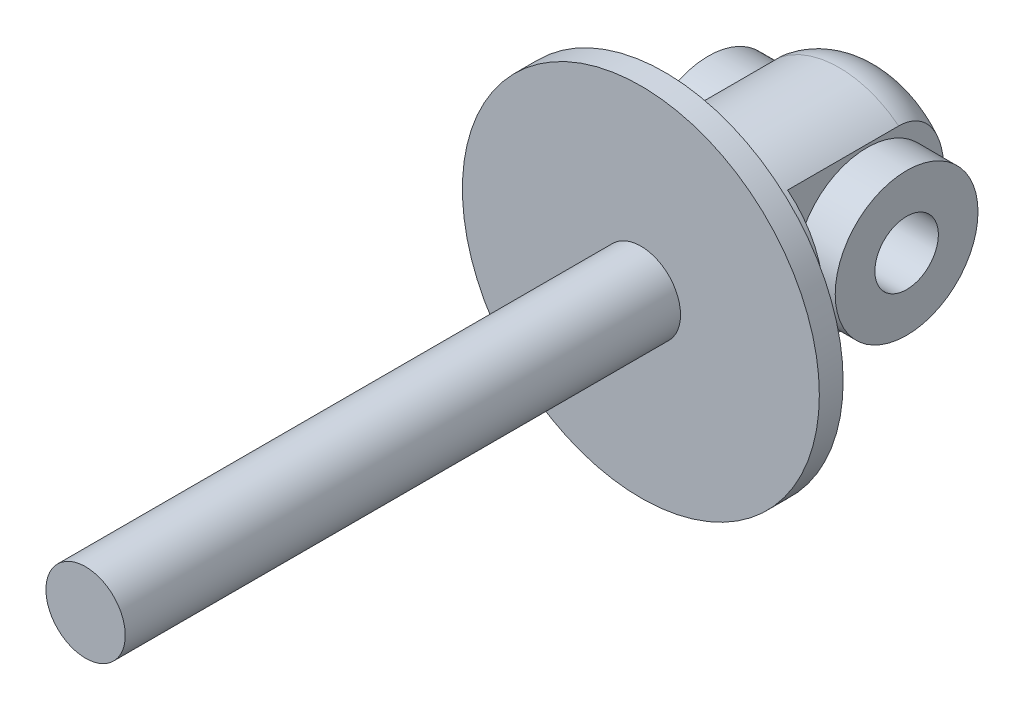
ISO-10303-21;
HEADER;
FILE_DESCRIPTION(('STEP AP214'),'2;1');
FILE_NAME('part.step','',(''),(''),'','','');
FILE_SCHEMA(('AUTOMOTIVE_DESIGN { 1 0 10303 214 1 1 1 1 }'));
ENDSEC;
DATA;
#1=APPLICATION_CONTEXT('core data for automotive mechanical design processes');
#2=APPLICATION_PROTOCOL_DEFINITION('international standard','automotive_design',2000,#1);
#3=PRODUCT_CONTEXT('',#1,'mechanical');
#4=PRODUCT('Part','Part','',(#3));
#5=PRODUCT_RELATED_PRODUCT_CATEGORY('part','',(#4));
#6=PRODUCT_DEFINITION_FORMATION('','',#4);
#7=PRODUCT_DEFINITION_CONTEXT('part definition',#1,'design');
#8=PRODUCT_DEFINITION('design','',#6,#7);
#9=PRODUCT_DEFINITION_SHAPE('','',#8);
#10=(LENGTH_UNIT() NAMED_UNIT(*) SI_UNIT(.MILLI.,.METRE.));
#11=(NAMED_UNIT(*) PLANE_ANGLE_UNIT() SI_UNIT($,.RADIAN.));
#12=(NAMED_UNIT(*) SI_UNIT($,.STERADIAN.) SOLID_ANGLE_UNIT());
#13=UNCERTAINTY_MEASURE_WITH_UNIT(LENGTH_MEASURE(1.E-05),#10,'distance_accuracy_value','');
#14=(GEOMETRIC_REPRESENTATION_CONTEXT(3) GLOBAL_UNCERTAINTY_ASSIGNED_CONTEXT((#13)) GLOBAL_UNIT_ASSIGNED_CONTEXT((#10,
#11,#12)) REPRESENTATION_CONTEXT('',''));
#15=CARTESIAN_POINT('',(0.,0.,0.));
#16=DIRECTION('',(0.,0.,1.));
#17=DIRECTION('',(1.,0.,0.));
#18=AXIS2_PLACEMENT_3D('',#15,#16,#17);
#19=CARTESIAN_POINT('',(-7.49999999999999,-22.5,-8.));
#20=DIRECTION('',(1.,0.,0.));
#21=DIRECTION('',(0.,0.,-1.));
#22=AXIS2_PLACEMENT_3D('',#19,#20,#21);
#23=PLANE('',#22);
#24=CARTESIAN_POINT('',(-7.5,0.,-27.8094750193111));
#25=CARTESIAN_POINT('',(-7.5,-0.18452162824242,-27.8094752958151));
#26=CARTESIAN_POINT('',(-7.5,-0.369043480287192,-27.8077270322999));
#27=CARTESIAN_POINT('',(-7.5,-0.737999394292286,-27.8006130628877));
#28=CARTESIAN_POINT('',(-7.5,-0.922433463434386,-27.7952477367066));
#29=CARTESIAN_POINT('',(-7.5,-1.29122559425462,-27.780538513706));
#30=CARTESIAN_POINT('',(-7.5,-1.47558358999919,-27.7711929215574));
#31=CARTESIAN_POINT('',(-7.5,-1.84401846668315,-27.7479507640883));
#32=CARTESIAN_POINT('',(-7.5,-2.0280953439834,-27.734054140347));
#33=CARTESIAN_POINT('',(-7.5,-2.39498843631837,-27.701027325669));
#34=CARTESIAN_POINT('',(-7.5,-2.57780665418327,-27.6819201299087));
#35=CARTESIAN_POINT('',(-7.5,-2.94269408038084,-27.6375682217561));
#36=CARTESIAN_POINT('',(-7.5,-3.12476323156505,-27.6123230495969));
#37=CARTESIAN_POINT('',(-7.5,-3.6691632505479,-27.5259360262262));
#38=CARTESIAN_POINT('',(-7.5,-4.029977395301,-27.4541196223952));
#39=CARTESIAN_POINT('',(-7.5,-4.57935988961709,-27.315114172541));
#40=CARTESIAN_POINT('',(-7.5,-4.7712225645297,-27.2608348848703));
#41=CARTESIAN_POINT('',(-7.5,-5.15109529504943,-27.1402411036094));
#42=CARTESIAN_POINT('',(-7.5,-5.3391068078654,-27.0739312594077));
#43=CARTESIAN_POINT('',(-7.5,-5.70992505463464,-26.9281486989919));
#44=CARTESIAN_POINT('',(-7.5,-5.8927332791208,-26.8486797977089));
#45=CARTESIAN_POINT('',(-7.5,-6.25155879665884,-26.6756224712841));
#46=CARTESIAN_POINT('',(-7.5,-6.4275772388346,-26.5820364486501));
#47=CARTESIAN_POINT('',(-7.5,-6.74413785402998,-26.3958384208508));
#48=CARTESIAN_POINT('',(-7.5,-6.8859302136676,-26.3053527427416));
#49=CARTESIAN_POINT('',(-7.5,-7.16205254122039,-26.1136422044668));
#50=CARTESIAN_POINT('',(-7.5,-7.29638393401337,-26.0124194056704));
#51=CARTESIAN_POINT('',(-7.5,-7.55627452274062,-25.7991822855038));
#52=CARTESIAN_POINT('',(-7.5,-7.6818315054992,-25.6871652583255));
#53=CARTESIAN_POINT('',(-7.5,-7.92270374400352,-25.4525813942248));
#54=CARTESIAN_POINT('',(-7.5,-8.03801892249803,-25.3300144777409));
#55=CARTESIAN_POINT('',(-7.5,-8.25792234562976,-25.0736714823962));
#56=CARTESIAN_POINT('',(-7.5,-8.36240569865935,-24.9398051473305));
#57=CARTESIAN_POINT('',(-7.5,-8.55796576900282,-24.662616920615));
#58=CARTESIAN_POINT('',(-7.5,-8.64904436046083,-24.5192963548439));
#59=CARTESIAN_POINT('',(-7.5,-8.81636481076627,-24.2243409104845));
#60=CARTESIAN_POINT('',(-7.5,-8.89261579636784,-24.0727112205184));
#61=CARTESIAN_POINT('',(-7.5,-9.02909243430966,-23.7624095052739));
#62=CARTESIAN_POINT('',(-7.5,-9.08932115899454,-23.6037388369551));
#63=CARTESIAN_POINT('',(-7.5,-9.1849514334904,-23.3052245459151));
#64=CARTESIAN_POINT('',(-7.5,-9.22272405795734,-23.166136129491));
#65=CARTESIAN_POINT('',(-7.5,-9.28547940350164,-22.8851087613884));
#66=CARTESIAN_POINT('',(-7.5,-9.31046370365637,-22.7431701638949));
#67=CARTESIAN_POINT('',(-7.5,-9.34730641699016,-22.4576599589478));
#68=CARTESIAN_POINT('',(-7.5,-9.35917031033292,-22.3140890586128));
#69=CARTESIAN_POINT('',(-7.5,-9.36963164548865,-22.0264648581988));
#70=CARTESIAN_POINT('',(-7.5,-9.36822954903947,-21.8824115750842));
#71=CARTESIAN_POINT('',(-7.5,-9.35280339576898,-21.6061914815275));
#72=CARTESIAN_POINT('',(-7.5,-9.33976569953801,-21.4739684759153));
#73=CARTESIAN_POINT('',(-7.5,-9.3025636387872,-21.2110534946456));
#74=CARTESIAN_POINT('',(-7.5,-9.27839574533066,-21.0803620180608));
#75=CARTESIAN_POINT('',(-7.5,-9.21922065645586,-20.8215410609612));
#76=CARTESIAN_POINT('',(-7.5,-9.1842198149556,-20.6934101253726));
#77=CARTESIAN_POINT('',(-7.5,-9.1037455253616,-20.4404340442512));
#78=CARTESIAN_POINT('',(-7.5,-9.05826815366643,-20.3155901493276));
#79=CARTESIAN_POINT('',(-7.5,-8.95699564520569,-20.0692031015505));
#80=CARTESIAN_POINT('',(-7.5,-8.90113499399755,-19.9476868658852));
#81=CARTESIAN_POINT('',(-7.5,-8.77987692751896,-19.7094920695402));
#82=CARTESIAN_POINT('',(-7.5,-8.71447610526943,-19.5928152563103));
#83=CARTESIAN_POINT('',(-7.5,-8.50489875856371,-19.2509911073174));
#84=CARTESIAN_POINT('',(-7.5,-8.34729299116934,-19.0339195251877));
#85=CARTESIAN_POINT('',(-7.5,-7.98870608163152,-18.609337427954));
#86=CARTESIAN_POINT('',(-7.5,-7.785297559506,-18.4039002281567));
#87=CARTESIAN_POINT('',(-7.5,-7.35109040646742,-18.0246758733926));
#88=CARTESIAN_POINT('',(-7.5,-7.12029612399673,-17.8508837047537));
#89=CARTESIAN_POINT('',(-7.5,-6.69864287979114,-17.5744409595824));
#90=CARTESIAN_POINT('',(-7.5,-6.51223410047272,-17.4648689537028));
#91=CARTESIAN_POINT('',(-7.5,-6.13034538679085,-17.2626904112622));
#92=CARTESIAN_POINT('',(-7.5,-5.93486117014358,-17.1700919878543));
#93=CARTESIAN_POINT('',(-7.5,-5.53658641063457,-17.0006313082269));
#94=CARTESIAN_POINT('',(-7.5,-5.33377659321379,-16.9238147555949));
#95=CARTESIAN_POINT('',(-7.5,-4.92331428460809,-16.784875362625));
#96=CARTESIAN_POINT('',(-7.5,-4.71566315546473,-16.7227484430634));
#97=CARTESIAN_POINT('',(-7.5,-4.02250667384634,-16.5386673542946));
#98=CARTESIAN_POINT('',(-7.5,-3.5294265636988,-16.4449803111871));
#99=CARTESIAN_POINT('',(-7.5,-2.78498720051464,-16.3412352530644));
#100=CARTESIAN_POINT('',(-7.5,-2.53568557770047,-16.3127705467372));
#101=CARTESIAN_POINT('',(-7.5,-2.03612434937436,-16.2658269581612));
#102=CARTESIAN_POINT('',(-7.5,-1.78586486368139,-16.2473468655648));
#103=CARTESIAN_POINT('',(-7.5,-1.2836311240865,-16.2184283009414));
#104=CARTESIAN_POINT('',(-7.5,-1.03165466176089,-16.208031590786));
#105=CARTESIAN_POINT('',(-7.5,-0.527501194688652,-16.1941849220443));
#106=CARTESIAN_POINT('',(-7.5,-0.275324180848882,-16.1907352988047));
#107=CARTESIAN_POINT('',(-7.5,0.228731345603008,-16.1903333462322));
#108=CARTESIAN_POINT('',(-7.5,0.480609853630207,-16.193373232494));
#109=CARTESIAN_POINT('',(-7.5,0.984173581494302,-16.2063332691715));
#110=CARTESIAN_POINT('',(-7.5,1.23585881660878,-16.2162528039696));
#111=CARTESIAN_POINT('',(-7.5,1.76278825668937,-16.2454935008677));
#112=CARTESIAN_POINT('',(-7.5,2.03798990109175,-16.2656211327378));
#113=CARTESIAN_POINT('',(-7.5,2.58731345976841,-16.3180418431018));
#114=CARTESIAN_POINT('',(-7.5,2.86143522597446,-16.3503365349836));
#115=CARTESIAN_POINT('',(-7.5,3.40623279358439,-16.4300545548583));
#116=CARTESIAN_POINT('',(-7.5,3.67691867401875,-16.4774071358833));
#117=CARTESIAN_POINT('',(-7.5,4.21439476079953,-16.5907053400646));
#118=CARTESIAN_POINT('',(-7.5,4.48118620316471,-16.6566449229111));
#119=CARTESIAN_POINT('',(-7.5,4.94217748017443,-16.7911834026755));
#120=CARTESIAN_POINT('',(-7.5,5.13778160857808,-16.8549558474619));
#121=CARTESIAN_POINT('',(-7.5,5.5239942274174,-16.9961265709521));
#122=CARTESIAN_POINT('',(-7.5,5.71460418712137,-17.073520789267));
#123=CARTESIAN_POINT('',(-7.5,6.0892198722189,-17.2430793617625));
#124=CARTESIAN_POINT('',(-7.5,6.27322442084439,-17.3352463319138));
#125=CARTESIAN_POINT('',(-7.5,6.63256976145458,-17.5351759469553));
#126=CARTESIAN_POINT('',(-7.5,6.80791280693599,-17.6429345063483));
#127=CARTESIAN_POINT('',(-7.5,7.10989658300675,-17.8487615005737));
#128=CARTESIAN_POINT('',(-7.5,7.2387010399764,-17.9436617626469));
#129=CARTESIAN_POINT('',(-7.5,7.48856622066219,-18.143229826346));
#130=CARTESIAN_POINT('',(-7.5,7.60962602152205,-18.2478987883735));
#131=CARTESIAN_POINT('',(-7.5,7.84271387792475,-18.4668045949393));
#132=CARTESIAN_POINT('',(-7.5,7.95474473789613,-18.5810384459287));
#133=CARTESIAN_POINT('',(-7.5,8.16854933672495,-18.8187268203134));
#134=CARTESIAN_POINT('',(-7.5,8.27032449994957,-18.9421800591116));
#135=CARTESIAN_POINT('',(-7.5,8.46313596223061,-19.1987356397018));
#136=CARTESIAN_POINT('',(-7.5,8.55408255407203,-19.3319055781875));
#137=CARTESIAN_POINT('',(-7.5,8.72304401015934,-19.6061418402457));
#138=CARTESIAN_POINT('',(-7.5,8.80106500403696,-19.747204378254));
#139=CARTESIAN_POINT('',(-7.5,8.94309470867639,-20.0362068877473));
#140=CARTESIAN_POINT('',(-7.5,9.00710515749598,-20.1841460034049));
#141=CARTESIAN_POINT('',(-7.5,9.12014361193693,-20.4856380297523));
#142=CARTESIAN_POINT('',(-7.5,9.16917373274798,-20.6391901444676));
#143=CARTESIAN_POINT('',(-7.5,9.24643392787081,-20.9313639562727));
#144=CARTESIAN_POINT('',(-7.5,9.2764768563288,-21.0695088202567));
#145=CARTESIAN_POINT('',(-7.5,9.32406143536891,-21.3479315795213));
#146=CARTESIAN_POINT('',(-7.5,9.34160421520928,-21.4882092809526));
#147=CARTESIAN_POINT('',(-7.5,9.36396002322678,-21.769719609589));
#148=CARTESIAN_POINT('',(-7.5,9.36877802253041,-21.9109518422674));
#149=CARTESIAN_POINT('',(-7.5,9.36563613906261,-22.1932734390957));
#150=CARTESIAN_POINT('',(-7.5,9.35767657732182,-22.3343628067459));
#151=CARTESIAN_POINT('',(-7.5,9.32998563551062,-22.6064011749062));
#152=CARTESIAN_POINT('',(-7.5,9.31102660205279,-22.7374295539783));
#153=CARTESIAN_POINT('',(-7.5,9.26218788836622,-22.9974780227225));
#154=CARTESIAN_POINT('',(-7.5,9.23230470755187,-23.1264974548056));
#155=CARTESIAN_POINT('',(-7.5,9.16196479385525,-23.3815508516768));
#156=CARTESIAN_POINT('',(-7.5,9.12151307666088,-23.5075862018083));
#157=CARTESIAN_POINT('',(-7.5,9.03044888037393,-23.7559772755244));
#158=CARTESIAN_POINT('',(-7.5,8.97983258590813,-23.8783315975104));
#159=CARTESIAN_POINT('',(-7.5,8.8680617574251,-24.1205569584555));
#160=CARTESIAN_POINT('',(-7.5,8.8067487702029,-24.2403549182387));
#161=CARTESIAN_POINT('',(-7.5,8.67480187441993,-24.4747211723639));
#162=CARTESIAN_POINT('',(-7.5,8.60416462323316,-24.5892875713423));
#163=CARTESIAN_POINT('',(-7.5,8.37928997825773,-24.9242270275788));
#164=CARTESIAN_POINT('',(-7.5,8.21201407264852,-25.13600210755));
#165=CARTESIAN_POINT('',(-7.5,7.832942739178,-25.5504485361803));
#166=CARTESIAN_POINT('',(-7.5,7.61853228584699,-25.7507010772538));
#167=CARTESIAN_POINT('',(-7.5,7.16337882817298,-26.1185076671662));
#168=CARTESIAN_POINT('',(-7.5,6.92262753032979,-26.2860513710234));
#169=CARTESIAN_POINT('',(-7.5,6.4788664395953,-26.5545024709803));
#170=CARTESIAN_POINT('',(-7.5,6.279707295078,-26.6619013252763));
#171=CARTESIAN_POINT('',(-7.5,5.87254463104013,-26.858559219587));
#172=CARTESIAN_POINT('',(-7.5,5.66453691936401,-26.9478095430477));
#173=CARTESIAN_POINT('',(-7.5,5.24180758530232,-27.1096214973705));
#174=CARTESIAN_POINT('',(-7.5,5.02707553901331,-27.1821555960046));
#175=CARTESIAN_POINT('',(-7.5,4.59305326757356,-27.3121001369762));
#176=CARTESIAN_POINT('',(-7.5,4.37376133898656,-27.3695048137837));
#177=CARTESIAN_POINT('',(-7.5,3.81417726059936,-27.4981886749365));
#178=CARTESIAN_POINT('',(-7.5,3.47183296905169,-27.5604951716191));
#179=CARTESIAN_POINT('',(-7.5,2.78359200614869,-27.6609019684328));
#180=CARTESIAN_POINT('',(-7.5,2.43769315620305,-27.6989863972919));
#181=CARTESIAN_POINT('',(-7.5,1.91723181279188,-27.7425563308733));
#182=CARTESIAN_POINT('',(-7.5,1.74318957751326,-27.7548291128016));
#183=CARTESIAN_POINT('',(-7.5,1.39487161182967,-27.7753986995787));
#184=CARTESIAN_POINT('',(-7.5,1.22059588725638,-27.7836956019396));
#185=CARTESIAN_POINT('',(-7.5,0.871965392986038,-27.796777523185));
#186=CARTESIAN_POINT('',(-7.5,0.697610658492168,-27.8015635129394));
#187=CARTESIAN_POINT('',(-7.5,0.34883735064389,-27.8079121855994));
#188=CARTESIAN_POINT('',(-7.5,0.174418775305037,-27.8094747579462));
#189=CARTESIAN_POINT('',(-7.5,0.,-27.8094750193111));
#190=B_SPLINE_CURVE_WITH_KNOTS('',3,(#24,#25,#26,#27,#28,#29,#30,#31,#32,#33,#34,#35,#36,#37,
#38,#39,#40,#41,#42,#43,#44,#45,#46,#47,#48,#49,#50,#51,#52,#53,#54,#55,#56,#57,#58,#59,#60,#61,
#62,#63,#64,#65,#66,#67,#68,#69,#70,#71,#72,#73,#74,#75,#76,#77,#78,#79,#80,#81,#82,#83,#84,#85,
#86,#87,#88,#89,#90,#91,#92,#93,#94,#95,#96,#97,#98,#99,#100,#101,#102,#103,#104,#105,#106,#107,
#108,#109,#110,#111,#112,#113,#114,#115,#116,#117,#118,#119,#120,#121,#122,#123,#124,#125,#126,
#127,#128,#129,#130,#131,#132,#133,#134,#135,#136,#137,#138,#139,#140,#141,#142,#143,#144,#145,
#146,#147,#148,#149,#150,#151,#152,#153,#154,#155,#156,#157,#158,#159,#160,#161,#162,#163,#164,
#165,#166,#167,#168,#169,#170,#171,#172,#173,#174,#175,#176,#177,#178,#179,#180,#181,#182,#183,
#184,#185,#186,#187,#188,#189),.UNSPECIFIED.,.T.,.F.,(4,2,2,2,2,2,2,2,2,2,2,2,2,2,2,2,2,2,2,2,2,
2,2,2,2,2,2,2,2,2,2,2,2,2,2,2,2,2,2,2,2,2,2,2,2,2,2,2,2,2,2,2,2,2,2,2,2,2,2,2,2,2,2,2,2,2,2,2,2,
2,2,2,2,2,2,2,2,2,2,2,2,2,4),(0.,0.553556541747909,1.10705498067111,1.66078940935171,
2.21453094651203,2.7658672034967,3.31724477121586,4.41912680182767,5.01698525599298,
5.61461314908643,6.21206808675635,6.80942146164093,7.31357153503217,7.81762499361293,
8.32180513447662,8.82598907791494,9.33467160980089,9.84328295415677,10.3515802378956,
10.8597799828438,11.291588037567,11.7233427606026,12.1549170790764,12.5864763761707,
12.9845986570771,13.3828472534997,13.7808627038906,14.1790274594522,14.5797954507881,
14.9807069160888,15.7821103743006,16.6461503316802,17.5100532757815,18.1578732554314,
18.8060020817716,19.4559821948789,20.1057815998326,21.6069748462106,22.3596793389022,
23.1122925673176,23.868768714911,24.625281377904,25.3808870860739,26.1364251884593,
26.9640249034878,27.7917343993233,28.6156111127982,29.4392203950451,30.0559954213972,
30.6725869093733,31.2892877047367,31.9058271963483,32.3853559200308,32.86494167852,
33.3443778968313,33.823747436381,34.3068464150844,34.7897156366604,35.2725249226046,
35.7552660053908,36.1788379642465,36.6023716529343,37.0257398573389,37.4490974249689,
37.8458122806135,38.2426543730445,38.639308470493,39.0361117351623,39.4393886143668,
39.8428104576492,40.6491243408277,41.5260051520067,42.403162850804,43.0810551134699,
43.7592721958252,44.4385984678268,45.1181832448309,46.1608437011148,47.2041866484774,
47.7275747628343,48.2509500399341,48.7741805338585,49.2974289735857),.UNSPECIFIED.);
#191=CARTESIAN_POINT('',(-7.5,9.3674969975976,-22.));
#192=VERTEX_POINT('',#191);
#193=CARTESIAN_POINT('',(-7.5,-9.36749699759766,-21.9999999999999));
#194=VERTEX_POINT('',#193);
#195=EDGE_CURVE('E92',#192,#194,#190,.T.);
#196=ORIENTED_EDGE('',*,*,#195,.T.);
#197=DIRECTION('',(0.,0.,1.));
#198=VECTOR('',#197,1.);
#199=CARTESIAN_POINT('',(-7.5,-9.3674969975976,-28.));
#200=LINE('',#199,#198);
#201=CARTESIAN_POINT('',(-7.49999999999999,-9.3674969975976,-8.));
#202=VERTEX_POINT('',#201);
#203=EDGE_CURVE('E88',#202,#194,#200,.F.);
#204=ORIENTED_EDGE('',*,*,#203,.F.);
#205=DIRECTION('',(0.,1.,0.));
#206=VECTOR('',#205,1.);
#207=CARTESIAN_POINT('',(-7.49999999999999,-22.5,-8.));
#208=LINE('',#207,#206);
#209=CARTESIAN_POINT('',(-7.49999999999999,9.36749699759759,-8.));
#210=VERTEX_POINT('',#209);
#211=EDGE_CURVE('E91',#202,#210,#208,.T.);
#212=ORIENTED_EDGE('',*,*,#211,.T.);
#213=DIRECTION('',(0.,0.,1.));
#214=VECTOR('',#213,1.);
#215=CARTESIAN_POINT('',(-7.5,9.3674969975976,-28.));
#216=LINE('',#215,#214);
#217=EDGE_CURVE('E62',#192,#210,#216,.T.);
#218=ORIENTED_EDGE('',*,*,#217,.F.);
#219=EDGE_LOOP('',(#196,#204,#212,#218));
#220=FACE_BOUND('',#219,.T.);
#221=CARTESIAN_POINT('',(-7.5,0.,-18.));
#222=DIRECTION('',(1.,0.,0.));
#223=DIRECTION('',(0.,0.,-1.));
#224=AXIS2_PLACEMENT_3D('',#221,#222,#223);
#225=CIRCLE('',#224,9.);
#226=CARTESIAN_POINT('',(-7.5,0.,-27.));
#227=VERTEX_POINT('',#226);
#228=EDGE_CURVE('E11',#227,#227,#225,.F.);
#229=ORIENTED_EDGE('',*,*,#228,.F.);
#230=EDGE_LOOP('',(#229));
#231=FACE_BOUND('',#230,.T.);
#232=ADVANCED_FACE('F44',(#220,#231),#23,.F.);
#233=CARTESIAN_POINT('',(7.5,-22.5,-8.));
#234=DIRECTION('',(-1.,0.,0.));
#235=DIRECTION('',(0.,0.,1.));
#236=AXIS2_PLACEMENT_3D('',#233,#234,#235);
#237=PLANE('',#236);
#238=CARTESIAN_POINT('',(7.5,0.,-27.8094750193111));
#239=CARTESIAN_POINT('',(7.5,0.18452162824242,-27.8094752958151));
#240=CARTESIAN_POINT('',(7.5,0.369043480287192,-27.8077270322999));
#241=CARTESIAN_POINT('',(7.5,0.737999394292285,-27.8006130628877));
#242=CARTESIAN_POINT('',(7.5,0.922433463434386,-27.7952477367066));
#243=CARTESIAN_POINT('',(7.5,1.29122559425462,-27.780538513706));
#244=CARTESIAN_POINT('',(7.5,1.47558358999919,-27.7711929215574));
#245=CARTESIAN_POINT('',(7.5,1.84401846668315,-27.7479507640883));
#246=CARTESIAN_POINT('',(7.5,2.0280953439834,-27.734054140347));
#247=CARTESIAN_POINT('',(7.5,2.39498843631837,-27.701027325669));
#248=CARTESIAN_POINT('',(7.5,2.57780665418326,-27.6819201299087));
#249=CARTESIAN_POINT('',(7.5,2.94269408038084,-27.6375682217561));
#250=CARTESIAN_POINT('',(7.5,3.12476323156505,-27.6123230495969));
#251=CARTESIAN_POINT('',(7.5,3.6691632505479,-27.5259360262262));
#252=CARTESIAN_POINT('',(7.5,4.02997739530099,-27.4541196223952));
#253=CARTESIAN_POINT('',(7.5,4.57935988961709,-27.315114172541));
#254=CARTESIAN_POINT('',(7.5,4.7712225645297,-27.2608348848703));
#255=CARTESIAN_POINT('',(7.5,5.15109529504943,-27.1402411036094));
#256=CARTESIAN_POINT('',(7.5,5.33910680786539,-27.0739312594077));
#257=CARTESIAN_POINT('',(7.5,5.70992505463463,-26.9281486989919));
#258=CARTESIAN_POINT('',(7.5,5.8927332791208,-26.8486797977089));
#259=CARTESIAN_POINT('',(7.5,6.25155879665883,-26.6756224712841));
#260=CARTESIAN_POINT('',(7.5,6.4275772388346,-26.5820364486501));
#261=CARTESIAN_POINT('',(7.5,6.74413785402998,-26.3958384208508));
#262=CARTESIAN_POINT('',(7.5,6.8859302136676,-26.3053527427416));
#263=CARTESIAN_POINT('',(7.5,7.16205254122039,-26.1136422044668));
#264=CARTESIAN_POINT('',(7.5,7.29638393401336,-26.0124194056704));
#265=CARTESIAN_POINT('',(7.5,7.55627452274061,-25.7991822855038));
#266=CARTESIAN_POINT('',(7.5,7.6818315054992,-25.6871652583255));
#267=CARTESIAN_POINT('',(7.5,7.92270374400352,-25.4525813942248));
#268=CARTESIAN_POINT('',(7.5,8.03801892249803,-25.3300144777409));
#269=CARTESIAN_POINT('',(7.5,8.25792234562975,-25.0736714823962));
#270=CARTESIAN_POINT('',(7.5,8.36240569865935,-24.9398051473305));
#271=CARTESIAN_POINT('',(7.5,8.55796576900282,-24.662616920615));
#272=CARTESIAN_POINT('',(7.5,8.64904436046083,-24.5192963548439));
#273=CARTESIAN_POINT('',(7.5,8.81636481076627,-24.2243409104845));
#274=CARTESIAN_POINT('',(7.5,8.89261579636783,-24.0727112205184));
#275=CARTESIAN_POINT('',(7.5,9.02909243430965,-23.7624095052739));
#276=CARTESIAN_POINT('',(7.5,9.08932115899453,-23.6037388369551));
#277=CARTESIAN_POINT('',(7.5,9.1849514334904,-23.3052245459151));
#278=CARTESIAN_POINT('',(7.5,9.22272405795733,-23.1661361294911));
#279=CARTESIAN_POINT('',(7.5,9.28547940350163,-22.8851087613884));
#280=CARTESIAN_POINT('',(7.5,9.31046370365637,-22.7431701638949));
#281=CARTESIAN_POINT('',(7.5,9.34730641699015,-22.4576599589478));
#282=CARTESIAN_POINT('',(7.5,9.35917031033292,-22.3140890586128));
#283=CARTESIAN_POINT('',(7.5,9.36963164548865,-22.0264648581988));
#284=CARTESIAN_POINT('',(7.5,9.36822954903948,-21.8824115750842));
#285=CARTESIAN_POINT('',(7.5,9.35280339576898,-21.6061914815275));
#286=CARTESIAN_POINT('',(7.5,9.33976569953801,-21.4739684759153));
#287=CARTESIAN_POINT('',(7.5,9.3025636387872,-21.2110534946456));
#288=CARTESIAN_POINT('',(7.5,9.27839574533066,-21.0803620180608));
#289=CARTESIAN_POINT('',(7.5,9.21922065645586,-20.8215410609612));
#290=CARTESIAN_POINT('',(7.5,9.1842198149556,-20.6934101253726));
#291=CARTESIAN_POINT('',(7.5,9.1037455253616,-20.4404340442512));
#292=CARTESIAN_POINT('',(7.5,9.05826815366643,-20.3155901493276));
#293=CARTESIAN_POINT('',(7.5,8.95699564520569,-20.0692031015505));
#294=CARTESIAN_POINT('',(7.5,8.90113499399755,-19.9476868658852));
#295=CARTESIAN_POINT('',(7.5,8.77987692751896,-19.7094920695403));
#296=CARTESIAN_POINT('',(7.5,8.71447610526943,-19.5928152563103));
#297=CARTESIAN_POINT('',(7.5,8.50489875856372,-19.2509911073174));
#298=CARTESIAN_POINT('',(7.5,8.34729299116934,-19.0339195251877));
#299=CARTESIAN_POINT('',(7.5,7.98870608163153,-18.609337427954));
#300=CARTESIAN_POINT('',(7.5,7.78529755950601,-18.4039002281567));
#301=CARTESIAN_POINT('',(7.5,7.35109040646743,-18.0246758733926));
#302=CARTESIAN_POINT('',(7.5,7.12029612399675,-17.8508837047537));
#303=CARTESIAN_POINT('',(7.5,6.69864287979115,-17.5744409595824));
#304=CARTESIAN_POINT('',(7.5,6.51223410047273,-17.4648689537028));
#305=CARTESIAN_POINT('',(7.5,6.13034538679086,-17.2626904112623));
#306=CARTESIAN_POINT('',(7.5,5.93486117014358,-17.1700919878543));
#307=CARTESIAN_POINT('',(7.5,5.53658641063458,-17.0006313082269));
#308=CARTESIAN_POINT('',(7.5,5.33377659321381,-16.9238147555949));
#309=CARTESIAN_POINT('',(7.5,4.9233142846081,-16.784875362625));
#310=CARTESIAN_POINT('',(7.5,4.71566315546475,-16.7227484430634));
#311=CARTESIAN_POINT('',(7.5,4.02250667384636,-16.5386673542946));
#312=CARTESIAN_POINT('',(7.5,3.52942656369882,-16.4449803111871));
#313=CARTESIAN_POINT('',(7.5,2.78498720051468,-16.3412352530644));
#314=CARTESIAN_POINT('',(7.5,2.53568557770051,-16.3127705467372));
#315=CARTESIAN_POINT('',(7.5,2.0361243493744,-16.2658269581612));
#316=CARTESIAN_POINT('',(7.5,1.78586486368143,-16.2473468655649));
#317=CARTESIAN_POINT('',(7.5,1.28363112408654,-16.2184283009414));
#318=CARTESIAN_POINT('',(7.5,1.03165466176093,-16.208031590786));
#319=CARTESIAN_POINT('',(7.5,0.5275011946887,-16.1941849220444));
#320=CARTESIAN_POINT('',(7.5,0.275324180848933,-16.1907352988047));
#321=CARTESIAN_POINT('',(7.5,-0.228731345602953,-16.1903333462322));
#322=CARTESIAN_POINT('',(7.5,-0.480609853630151,-16.193373232494));
#323=CARTESIAN_POINT('',(7.5,-0.984173581494243,-16.2063332691715));
#324=CARTESIAN_POINT('',(7.5,-1.23585881660871,-16.2162528039696));
#325=CARTESIAN_POINT('',(7.5,-1.76278825668931,-16.2454935008677));
#326=CARTESIAN_POINT('',(7.5,-2.03798990109169,-16.2656211327378));
#327=CARTESIAN_POINT('',(7.5,-2.58731345976837,-16.3180418431017));
#328=CARTESIAN_POINT('',(7.5,-2.86143522597442,-16.3503365349836));
#329=CARTESIAN_POINT('',(7.5,-3.40623279358436,-16.4300545548583));
#330=CARTESIAN_POINT('',(7.5,-3.67691867401872,-16.4774071358833));
#331=CARTESIAN_POINT('',(7.5,-4.21439476079951,-16.5907053400646));
#332=CARTESIAN_POINT('',(7.5,-4.48118620316469,-16.6566449229111));
#333=CARTESIAN_POINT('',(7.5,-4.94217748017442,-16.7911834026755));
#334=CARTESIAN_POINT('',(7.5,-5.13778160857806,-16.8549558474619));
#335=CARTESIAN_POINT('',(7.5,-5.52399422741739,-16.9961265709521));
#336=CARTESIAN_POINT('',(7.5,-5.71460418712136,-17.0735207892669));
#337=CARTESIAN_POINT('',(7.5,-6.08921987221888,-17.2430793617624));
#338=CARTESIAN_POINT('',(7.5,-6.27322442084437,-17.3352463319138));
#339=CARTESIAN_POINT('',(7.5,-6.63256976145456,-17.5351759469553));
#340=CARTESIAN_POINT('',(7.5,-6.80791280693597,-17.6429345063483));
#341=CARTESIAN_POINT('',(7.5,-7.10989658300673,-17.8487615005736));
#342=CARTESIAN_POINT('',(7.5,-7.23870103997639,-17.9436617626469));
#343=CARTESIAN_POINT('',(7.5,-7.48856622066218,-18.143229826346));
#344=CARTESIAN_POINT('',(7.5,-7.60962602152204,-18.2478987883735));
#345=CARTESIAN_POINT('',(7.5,-7.84271387792474,-18.4668045949393));
#346=CARTESIAN_POINT('',(7.5,-7.95474473789612,-18.5810384459287));
#347=CARTESIAN_POINT('',(7.5,-8.16854933672494,-18.8187268203134));
#348=CARTESIAN_POINT('',(7.5,-8.27032449994956,-18.9421800591116));
#349=CARTESIAN_POINT('',(7.5,-8.4631359622306,-19.1987356397018));
#350=CARTESIAN_POINT('',(7.5,-8.55408255407202,-19.3319055781875));
#351=CARTESIAN_POINT('',(7.5,-8.72304401015933,-19.6061418402457));
#352=CARTESIAN_POINT('',(7.5,-8.80106500403696,-19.747204378254));
#353=CARTESIAN_POINT('',(7.5,-8.94309470867639,-20.0362068877473));
#354=CARTESIAN_POINT('',(7.5,-9.00710515749598,-20.1841460034049));
#355=CARTESIAN_POINT('',(7.5,-9.12014361193693,-20.4856380297523));
#356=CARTESIAN_POINT('',(7.5,-9.16917373274798,-20.6391901444676));
#357=CARTESIAN_POINT('',(7.5,-9.24643392787081,-20.9313639562727));
#358=CARTESIAN_POINT('',(7.5,-9.2764768563288,-21.0695088202567));
#359=CARTESIAN_POINT('',(7.5,-9.32406143536891,-21.3479315795213));
#360=CARTESIAN_POINT('',(7.5,-9.34160421520928,-21.4882092809526));
#361=CARTESIAN_POINT('',(7.5,-9.36396002322678,-21.769719609589));
#362=CARTESIAN_POINT('',(7.5,-9.36877802253041,-21.9109518422674));
#363=CARTESIAN_POINT('',(7.5,-9.36563613906261,-22.1932734390957));
#364=CARTESIAN_POINT('',(7.5,-9.35767657732182,-22.3343628067459));
#365=CARTESIAN_POINT('',(7.5,-9.32998563551062,-22.6064011749062));
#366=CARTESIAN_POINT('',(7.5,-9.31102660205279,-22.7374295539783));
#367=CARTESIAN_POINT('',(7.5,-9.26218788836622,-22.9974780227225));
#368=CARTESIAN_POINT('',(7.5,-9.23230470755187,-23.1264974548056));
#369=CARTESIAN_POINT('',(7.5,-9.16196479385525,-23.3815508516768));
#370=CARTESIAN_POINT('',(7.5,-9.12151307666088,-23.5075862018083));
#371=CARTESIAN_POINT('',(7.5,-9.03044888037393,-23.7559772755244));
#372=CARTESIAN_POINT('',(7.5,-8.97983258590814,-23.8783315975104));
#373=CARTESIAN_POINT('',(7.5,-8.8680617574251,-24.1205569584555));
#374=CARTESIAN_POINT('',(7.5,-8.80674877020291,-24.2403549182387));
#375=CARTESIAN_POINT('',(7.5,-8.67480187441993,-24.4747211723639));
#376=CARTESIAN_POINT('',(7.5,-8.60416462323317,-24.5892875713423));
#377=CARTESIAN_POINT('',(7.5,-8.37928997825773,-24.9242270275788));
#378=CARTESIAN_POINT('',(7.5,-8.21201407264852,-25.13600210755));
#379=CARTESIAN_POINT('',(7.5,-7.83294273917801,-25.5504485361803));
#380=CARTESIAN_POINT('',(7.5,-7.618532285847,-25.7507010772538));
#381=CARTESIAN_POINT('',(7.5,-7.16337882817298,-26.1185076671662));
#382=CARTESIAN_POINT('',(7.5,-6.9226275303298,-26.2860513710234));
#383=CARTESIAN_POINT('',(7.5,-6.4788664395953,-26.5545024709803));
#384=CARTESIAN_POINT('',(7.5,-6.279707295078,-26.6619013252763));
#385=CARTESIAN_POINT('',(7.5,-5.87254463104013,-26.858559219587));
#386=CARTESIAN_POINT('',(7.5,-5.66453691936401,-26.9478095430477));
#387=CARTESIAN_POINT('',(7.5,-5.24180758530233,-27.1096214973705));
#388=CARTESIAN_POINT('',(7.5,-5.02707553901331,-27.1821555960046));
#389=CARTESIAN_POINT('',(7.5,-4.59305326757356,-27.3121001369762));
#390=CARTESIAN_POINT('',(7.5,-4.37376133898656,-27.3695048137837));
#391=CARTESIAN_POINT('',(7.5,-3.81417726059937,-27.4981886749365));
#392=CARTESIAN_POINT('',(7.5,-3.4718329690517,-27.5604951716191));
#393=CARTESIAN_POINT('',(7.5,-2.78359200614869,-27.6609019684328));
#394=CARTESIAN_POINT('',(7.5,-2.43769315620305,-27.6989863972919));
#395=CARTESIAN_POINT('',(7.5,-1.91723181279187,-27.7425563308733));
#396=CARTESIAN_POINT('',(7.5,-1.74318957751326,-27.7548291128016));
#397=CARTESIAN_POINT('',(7.5,-1.39487161182967,-27.7753986995787));
#398=CARTESIAN_POINT('',(7.5,-1.22059588725638,-27.7836956019396));
#399=CARTESIAN_POINT('',(7.5,-0.871965392986035,-27.796777523185));
#400=CARTESIAN_POINT('',(7.5,-0.697610658492165,-27.8015635129394));
#401=CARTESIAN_POINT('',(7.5,-0.348837350643889,-27.8079121855994));
#402=CARTESIAN_POINT('',(7.5,-0.174418775305036,-27.8094747579462));
#403=CARTESIAN_POINT('',(7.5,0.,-27.8094750193111));
#404=B_SPLINE_CURVE_WITH_KNOTS('',3,(#238,#239,#240,#241,#242,#243,#244,#245,#246,#247,#248,
#249,#250,#251,#252,#253,#254,#255,#256,#257,#258,#259,#260,#261,#262,#263,#264,#265,#266,#267,
#268,#269,#270,#271,#272,#273,#274,#275,#276,#277,#278,#279,#280,#281,#282,#283,#284,#285,#286,
#287,#288,#289,#290,#291,#292,#293,#294,#295,#296,#297,#298,#299,#300,#301,#302,#303,#304,#305,
#306,#307,#308,#309,#310,#311,#312,#313,#314,#315,#316,#317,#318,#319,#320,#321,#322,#323,#324,
#325,#326,#327,#328,#329,#330,#331,#332,#333,#334,#335,#336,#337,#338,#339,#340,#341,#342,#343,
#344,#345,#346,#347,#348,#349,#350,#351,#352,#353,#354,#355,#356,#357,#358,#359,#360,#361,#362,
#363,#364,#365,#366,#367,#368,#369,#370,#371,#372,#373,#374,#375,#376,#377,#378,#379,#380,#381,
#382,#383,#384,#385,#386,#387,#388,#389,#390,#391,#392,#393,#394,#395,#396,#397,#398,#399,#400,
#401,#402,#403),.UNSPECIFIED.,.T.,.F.,(4,2,2,2,2,2,2,2,2,2,2,2,2,2,2,2,2,2,2,2,2,2,2,2,2,2,2,2,
2,2,2,2,2,2,2,2,2,2,2,2,2,2,2,2,2,2,2,2,2,2,2,2,2,2,2,2,2,2,2,2,2,2,2,2,2,2,2,2,2,2,2,2,2,2,2,2,
2,2,2,2,2,2,4),(0.,0.553556541747909,1.10705498067111,1.66078940935171,2.21453094651203,
2.7658672034967,3.31724477121585,4.41912680182767,5.01698525599297,5.61461314908642,
6.21206808675634,6.80942146164093,7.31357153503217,7.81762499361292,8.32180513447662,
8.82598907791493,9.33467160980088,9.84328295415676,10.3515802378956,10.8597799828438,
11.291588037567,11.7233427606026,12.1549170790764,12.5864763761706,12.9845986570771,
13.3828472534997,13.7808627038906,14.1790274594521,14.579795450788,14.9807069160888,
15.7821103743006,16.6461503316802,17.5100532757815,18.1578732554314,18.8060020817716,
19.4559821948789,20.1057815998326,21.6069748462105,22.3596793389022,23.1122925673176,
23.8687687149109,24.6252813779039,25.3808870860739,26.1364251884592,26.9640249034878,
27.7917343993232,28.6156111127982,29.4392203950451,30.0559954213971,30.6725869093732,
31.2892877047367,31.9058271963483,32.3853559200308,32.8649416785199,33.3443778968313,
33.823747436381,34.3068464150843,34.7897156366604,35.2725249226045,35.7552660053908,
36.1788379642465,36.6023716529343,37.0257398573389,37.4490974249689,37.8458122806135,
38.2426543730445,38.639308470493,39.0361117351622,39.4393886143668,39.8428104576492,
40.6491243408277,41.5260051520067,42.403162850804,43.0810551134699,43.7592721958252,
44.4385984678267,45.1181832448308,46.1608437011148,47.2041866484774,47.7275747628343,
48.2509500399341,48.7741805338585,49.2974289735857),.UNSPECIFIED.);
#405=CARTESIAN_POINT('',(7.5,-9.3674969975976,-22.));
#406=VERTEX_POINT('',#405);
#407=CARTESIAN_POINT('',(7.5,9.36749699759766,-21.9999999999999));
#408=VERTEX_POINT('',#407);
#409=EDGE_CURVE('E111',#406,#408,#404,.T.);
#410=ORIENTED_EDGE('',*,*,#409,.T.);
#411=DIRECTION('',(0.,0.,1.));
#412=VECTOR('',#411,1.);
#413=CARTESIAN_POINT('',(7.5,9.3674969975976,-28.));
#414=LINE('',#413,#412);
#415=CARTESIAN_POINT('',(7.5,9.3674969975976,-8.));
#416=VERTEX_POINT('',#415);
#417=EDGE_CURVE('E194',#416,#408,#414,.F.);
#418=ORIENTED_EDGE('',*,*,#417,.F.);
#419=DIRECTION('',(0.,1.,0.));
#420=VECTOR('',#419,1.);
#421=CARTESIAN_POINT('',(7.5,-22.5,-8.));
#422=LINE('',#421,#420);
#423=CARTESIAN_POINT('',(7.5,-9.3674969975976,-8.));
#424=VERTEX_POINT('',#423);
#425=EDGE_CURVE('E98',#424,#416,#422,.T.);
#426=ORIENTED_EDGE('',*,*,#425,.F.);
#427=DIRECTION('',(0.,0.,1.));
#428=VECTOR('',#427,1.);
#429=CARTESIAN_POINT('',(7.5,-9.3674969975976,-28.));
#430=LINE('',#429,#428);
#431=EDGE_CURVE('E70',#406,#424,#430,.T.);
#432=ORIENTED_EDGE('',*,*,#431,.F.);
#433=EDGE_LOOP('',(#410,#418,#426,#432));
#434=FACE_BOUND('',#433,.T.);
#435=CARTESIAN_POINT('',(7.5,0.,-18.));
#436=DIRECTION('',(-1.,0.,0.));
#437=DIRECTION('',(0.,0.,1.));
#438=AXIS2_PLACEMENT_3D('',#435,#436,#437);
#439=CIRCLE('',#438,9.);
#440=CARTESIAN_POINT('',(7.5,0.,-9.00000000000001));
#441=VERTEX_POINT('',#440);
#442=EDGE_CURVE('E49',#441,#441,#439,.F.);
#443=ORIENTED_EDGE('',*,*,#442,.F.);
#444=EDGE_LOOP('',(#443));
#445=FACE_BOUND('',#444,.T.);
#446=ADVANCED_FACE('F127',(#434,#445),#237,.F.);
#447=CARTESIAN_POINT('',(0.,0.,3.));
#448=DIRECTION('',(0.,0.,-1.));
#449=DIRECTION('',(-1.,0.,0.));
#450=AXIS2_PLACEMENT_3D('',#447,#448,#449);
#451=CYLINDRICAL_SURFACE('',#450,22.5);
#452=CARTESIAN_POINT('',(0.,0.,3.));
#453=DIRECTION('',(0.,0.,1.));
#454=DIRECTION('',(1.,0.,0.));
#455=AXIS2_PLACEMENT_3D('',#452,#453,#454);
#456=CIRCLE('',#455,22.5);
#457=CARTESIAN_POINT('',(22.5,0.,3.));
#458=VERTEX_POINT('',#457);
#459=EDGE_CURVE('E167',#458,#458,#456,.T.);
#460=ORIENTED_EDGE('',*,*,#459,.F.);
#461=EDGE_LOOP('',(#460));
#462=FACE_BOUND('',#461,.T.);
#463=CARTESIAN_POINT('',(0.,0.,0.));
#464=DIRECTION('',(0.,0.,1.));
#465=DIRECTION('',(1.,0.,0.));
#466=AXIS2_PLACEMENT_3D('',#463,#464,#465);
#467=CIRCLE('',#466,22.5);
#468=CARTESIAN_POINT('',(22.5,0.,0.));
#469=VERTEX_POINT('',#468);
#470=EDGE_CURVE('E170',#469,#469,#467,.T.);
#471=ORIENTED_EDGE('',*,*,#470,.T.);
#472=EDGE_LOOP('',(#471));
#473=FACE_BOUND('',#472,.T.);
#474=ADVANCED_FACE('F132',(#462,#473),#451,.T.);
#475=CARTESIAN_POINT('',(0.,0.,3.));
#476=DIRECTION('',(0.,0.,1.));
#477=DIRECTION('',(1.,0.,0.));
#478=AXIS2_PLACEMENT_3D('',#475,#476,#477);
#479=PLANE('',#478);
#480=CARTESIAN_POINT('',(0.,0.,3.));
#481=DIRECTION('',(0.,0.,1.));
#482=DIRECTION('',(1.,0.,0.));
#483=AXIS2_PLACEMENT_3D('',#480,#481,#482);
#484=CIRCLE('',#483,5.);
#485=CARTESIAN_POINT('',(5.,0.,3.));
#486=VERTEX_POINT('',#485);
#487=EDGE_CURVE('E177',#486,#486,#484,.T.);
#488=ORIENTED_EDGE('',*,*,#487,.F.);
#489=EDGE_LOOP('',(#488));
#490=FACE_BOUND('',#489,.T.);
#491=ORIENTED_EDGE('',*,*,#459,.T.);
#492=EDGE_LOOP('',(#491));
#493=FACE_BOUND('',#492,.T.);
#494=ADVANCED_FACE('F154',(#490,#493),#479,.T.);
#495=CARTESIAN_POINT('',(0.,0.,0.));
#496=DIRECTION('',(0.,0.,1.));
#497=DIRECTION('',(1.,0.,0.));
#498=AXIS2_PLACEMENT_3D('',#495,#496,#497);
#499=PLANE('',#498);
#500=CARTESIAN_POINT('',(0.,0.,0.));
#501=DIRECTION('',(0.,0.,-1.));
#502=DIRECTION('',(-1.,0.,0.));
#503=AXIS2_PLACEMENT_3D('',#500,#501,#502);
#504=CIRCLE('',#503,12.);
#505=CARTESIAN_POINT('',(-12.,0.,0.));
#506=VERTEX_POINT('',#505);
#507=EDGE_CURVE('E187',#506,#506,#504,.T.);
#508=ORIENTED_EDGE('',*,*,#507,.F.);
#509=EDGE_LOOP('',(#508));
#510=FACE_BOUND('',#509,.T.);
#511=ORIENTED_EDGE('',*,*,#470,.F.);
#512=EDGE_LOOP('',(#511));
#513=FACE_BOUND('',#512,.T.);
#514=ADVANCED_FACE('F152',(#510,#513),#499,.F.);
#515=CARTESIAN_POINT('',(0.,0.,73.));
#516=DIRECTION('',(0.,0.,-1.));
#517=DIRECTION('',(-1.,0.,0.));
#518=AXIS2_PLACEMENT_3D('',#515,#516,#517);
#519=CYLINDRICAL_SURFACE('',#518,5.);
#520=CARTESIAN_POINT('',(0.,0.,73.));
#521=DIRECTION('',(0.,0.,1.));
#522=DIRECTION('',(1.,0.,0.));
#523=AXIS2_PLACEMENT_3D('',#520,#521,#522);
#524=CIRCLE('',#523,5.);
#525=CARTESIAN_POINT('',(5.,0.,73.));
#526=VERTEX_POINT('',#525);
#527=EDGE_CURVE('E173',#526,#526,#524,.T.);
#528=ORIENTED_EDGE('',*,*,#527,.F.);
#529=EDGE_LOOP('',(#528));
#530=FACE_BOUND('',#529,.T.);
#531=ORIENTED_EDGE('',*,*,#487,.T.);
#532=EDGE_LOOP('',(#531));
#533=FACE_BOUND('',#532,.T.);
#534=ADVANCED_FACE('F148',(#530,#533),#519,.T.);
#535=CARTESIAN_POINT('',(0.,0.,73.));
#536=DIRECTION('',(0.,0.,1.));
#537=DIRECTION('',(1.,0.,0.));
#538=AXIS2_PLACEMENT_3D('',#535,#536,#537);
#539=PLANE('',#538);
#540=ORIENTED_EDGE('',*,*,#527,.T.);
#541=EDGE_LOOP('',(#540));
#542=FACE_BOUND('',#541,.T.);
#543=ADVANCED_FACE('F145',(#542),#539,.T.);
#544=CARTESIAN_POINT('',(0.,0.,-28.));
#545=DIRECTION('',(0.,0.,1.));
#546=DIRECTION('',(1.,0.,0.));
#547=AXIS2_PLACEMENT_3D('',#544,#545,#546);
#548=CYLINDRICAL_SURFACE('',#547,12.);
#549=CARTESIAN_POINT('',(0.,0.,-22.));
#550=DIRECTION('',(0.,0.,-1.));
#551=DIRECTION('',(-1.,0.,0.));
#552=AXIS2_PLACEMENT_3D('',#549,#550,#551);
#553=CIRCLE('',#552,12.);
#554=EDGE_CURVE('E188',#194,#406,#553,.F.);
#555=ORIENTED_EDGE('',*,*,#554,.T.);
#556=ORIENTED_EDGE('',*,*,#431,.T.);
#557=CARTESIAN_POINT('',(0.,0.,-8.));
#558=DIRECTION('',(0.,0.,1.));
#559=DIRECTION('',(1.,0.,0.));
#560=AXIS2_PLACEMENT_3D('',#557,#558,#559);
#561=CIRCLE('',#560,12.);
#562=EDGE_CURVE('E110',#424,#416,#561,.T.);
#563=ORIENTED_EDGE('',*,*,#562,.T.);
#564=ORIENTED_EDGE('',*,*,#417,.T.);
#565=EDGE_CURVE('E186',#408,#192,#553,.F.);
#566=ORIENTED_EDGE('',*,*,#565,.T.);
#567=ORIENTED_EDGE('',*,*,#217,.T.);
#568=CARTESIAN_POINT('',(0.,0.,-8.));
#569=DIRECTION('',(0.,0.,1.));
#570=DIRECTION('',(1.,0.,0.));
#571=AXIS2_PLACEMENT_3D('',#568,#569,#570);
#572=CIRCLE('',#571,12.);
#573=EDGE_CURVE('E102',#210,#202,#572,.T.);
#574=ORIENTED_EDGE('',*,*,#573,.T.);
#575=ORIENTED_EDGE('',*,*,#203,.T.);
#576=EDGE_LOOP('',(#555,#556,#563,#564,#566,#567,#574,#575));
#577=FACE_BOUND('',#576,.T.);
#578=ORIENTED_EDGE('',*,*,#507,.T.);
#579=EDGE_LOOP('',(#578));
#580=FACE_BOUND('',#579,.T.);
#581=ADVANCED_FACE('F106',(#577,#580),#548,.T.);
#582=CARTESIAN_POINT('',(0.,0.,-28.));
#583=DIRECTION('',(0.,0.,-1.));
#584=DIRECTION('',(-1.,0.,0.));
#585=AXIS2_PLACEMENT_3D('',#582,#583,#584);
#586=PLANE('',#585);
#587=CARTESIAN_POINT('',(0.,0.,-28.));
#588=DIRECTION('',(0.,0.,-1.));
#589=DIRECTION('',(-1.,0.,0.));
#590=AXIS2_PLACEMENT_3D('',#587,#588,#589);
#591=CIRCLE('',#590,6.);
#592=CARTESIAN_POINT('',(-6.,0.,-28.));
#593=VERTEX_POINT('',#592);
#594=EDGE_CURVE('E183',#593,#593,#591,.T.);
#595=ORIENTED_EDGE('',*,*,#594,.T.);
#596=EDGE_LOOP('',(#595));
#597=FACE_BOUND('',#596,.T.);
#598=ADVANCED_FACE('F139',(#597),#586,.T.);
#599=CARTESIAN_POINT('',(0.,0.,-22.));
#600=DIRECTION('',(0.,0.,-1.));
#601=DIRECTION('',(-1.,0.,0.));
#602=AXIS2_PLACEMENT_3D('',#599,#600,#601);
#603=TOROIDAL_SURFACE('',#602,6.,6.);
#604=ORIENTED_EDGE('',*,*,#409,.F.);
#605=ORIENTED_EDGE('',*,*,#554,.F.);
#606=ORIENTED_EDGE('',*,*,#195,.F.);
#607=ORIENTED_EDGE('',*,*,#565,.F.);
#608=EDGE_LOOP('',(#604,#605,#606,#607));
#609=FACE_BOUND('',#608,.T.);
#610=ORIENTED_EDGE('',*,*,#594,.F.);
#611=EDGE_LOOP('',(#610));
#612=FACE_BOUND('',#611,.T.);
#613=ADVANCED_FACE('F46',(#609,#612),#603,.T.);
#614=CARTESIAN_POINT('',(-33.3922449902606,-22.5,-7.99999999999999));
#615=DIRECTION('',(0.,0.,1.));
#616=DIRECTION('',(1.,0.,0.));
#617=AXIS2_PLACEMENT_3D('',#614,#615,#616);
#618=PLANE('',#617);
#619=ORIENTED_EDGE('',*,*,#211,.F.);
#620=ORIENTED_EDGE('',*,*,#573,.F.);
#621=EDGE_LOOP('',(#619,#620));
#622=FACE_BOUND('',#621,.T.);
#623=ADVANCED_FACE('F101',(#622),#618,.F.);
#624=CARTESIAN_POINT('',(33.3922449902606,-22.5,-8.));
#625=DIRECTION('',(0.,0.,1.));
#626=DIRECTION('',(1.,0.,0.));
#627=AXIS2_PLACEMENT_3D('',#624,#625,#626);
#628=PLANE('',#627);
#629=ORIENTED_EDGE('',*,*,#425,.T.);
#630=ORIENTED_EDGE('',*,*,#562,.F.);
#631=EDGE_LOOP('',(#629,#630));
#632=FACE_BOUND('',#631,.T.);
#633=ADVANCED_FACE('F133',(#632),#628,.F.);
#634=CARTESIAN_POINT('',(12.5,0.,-18.));
#635=DIRECTION('',(-1.,0.,0.));
#636=DIRECTION('',(0.,0.,1.));
#637=AXIS2_PLACEMENT_3D('',#634,#635,#636);
#638=CYLINDRICAL_SURFACE('',#637,9.);
#639=CARTESIAN_POINT('',(12.5,0.,-18.));
#640=DIRECTION('',(1.,0.,0.));
#641=DIRECTION('',(0.,0.,-1.));
#642=AXIS2_PLACEMENT_3D('',#639,#640,#641);
#643=CIRCLE('',#642,9.);
#644=CARTESIAN_POINT('',(12.5,0.,-27.));
#645=VERTEX_POINT('',#644);
#646=EDGE_CURVE('E104',#645,#645,#643,.T.);
#647=ORIENTED_EDGE('',*,*,#646,.F.);
#648=EDGE_LOOP('',(#647));
#649=FACE_BOUND('',#648,.T.);
#650=ORIENTED_EDGE('',*,*,#442,.T.);
#651=EDGE_LOOP('',(#650));
#652=FACE_BOUND('',#651,.T.);
#653=ADVANCED_FACE('F239',(#649,#652),#638,.T.);
#654=CARTESIAN_POINT('',(12.5,0.,-18.));
#655=DIRECTION('',(1.,0.,0.));
#656=DIRECTION('',(0.,0.,-1.));
#657=AXIS2_PLACEMENT_3D('',#654,#655,#656);
#658=PLANE('',#657);
#659=ORIENTED_EDGE('',*,*,#646,.T.);
#660=EDGE_LOOP('',(#659));
#661=FACE_BOUND('',#660,.T.);
#662=CARTESIAN_POINT('',(12.5,0.,-18.));
#663=DIRECTION('',(1.,0.,0.));
#664=DIRECTION('',(0.,0.,-1.));
#665=AXIS2_PLACEMENT_3D('',#662,#663,#664);
#666=CIRCLE('',#665,4.);
#667=CARTESIAN_POINT('',(12.5,0.,-14.));
#668=VERTEX_POINT('',#667);
#669=EDGE_CURVE('E222',#668,#668,#666,.T.);
#670=ORIENTED_EDGE('',*,*,#669,.F.);
#671=EDGE_LOOP('',(#670));
#672=FACE_BOUND('',#671,.T.);
#673=ADVANCED_FACE('F237',(#661,#672),#658,.T.);
#674=CARTESIAN_POINT('',(22.5,0.,-18.));
#675=DIRECTION('',(-1.,0.,0.));
#676=DIRECTION('',(0.,0.,1.));
#677=AXIS2_PLACEMENT_3D('',#674,#675,#676);
#678=CYLINDRICAL_SURFACE('',#677,4.);
#679=CARTESIAN_POINT('',(-12.5,0.,-18.));
#680=DIRECTION('',(1.,0.,0.));
#681=DIRECTION('',(0.,0.,-1.));
#682=AXIS2_PLACEMENT_3D('',#679,#680,#681);
#683=CIRCLE('',#682,4.);
#684=CARTESIAN_POINT('',(-12.5,0.,-14.));
#685=VERTEX_POINT('',#684);
#686=EDGE_CURVE('E226',#685,#685,#683,.T.);
#687=CARTESIAN_POINT('',(12.5,0.,-14.));
#688=CARTESIAN_POINT('',(12.2395833333333,0.,-14.));
#689=CARTESIAN_POINT('',(11.9791666666667,0.,-14.));
#690=CARTESIAN_POINT('',(11.4583333333333,0.,-14.));
#691=CARTESIAN_POINT('',(11.1979166666667,0.,-14.));
#692=CARTESIAN_POINT('',(10.6770833333333,0.,-14.));
#693=CARTESIAN_POINT('',(10.4166666666667,0.,-14.));
#694=CARTESIAN_POINT('',(9.89583333333333,0.,-14.));
#695=CARTESIAN_POINT('',(9.63541666666667,0.,-14.));
#696=CARTESIAN_POINT('',(9.11458333333333,0.,-14.));
#697=CARTESIAN_POINT('',(8.85416666666667,0.,-14.));
#698=CARTESIAN_POINT('',(8.33333333333333,0.,-14.));
#699=CARTESIAN_POINT('',(8.07291666666667,0.,-14.));
#700=CARTESIAN_POINT('',(7.55208333333333,0.,-14.));
#701=CARTESIAN_POINT('',(7.29166666666666,0.,-14.));
#702=CARTESIAN_POINT('',(6.77083333333333,0.,-14.));
#703=CARTESIAN_POINT('',(6.51041666666667,0.,-14.));
#704=CARTESIAN_POINT('',(5.98958333333334,0.,-14.));
#705=CARTESIAN_POINT('',(5.72916666666667,0.,-14.));
#706=CARTESIAN_POINT('',(5.20833333333333,0.,-14.));
#707=CARTESIAN_POINT('',(4.94791666666667,0.,-14.));
#708=CARTESIAN_POINT('',(4.42708333333333,0.,-14.));
#709=CARTESIAN_POINT('',(4.16666666666667,0.,-14.));
#710=CARTESIAN_POINT('',(3.64583333333333,0.,-14.));
#711=CARTESIAN_POINT('',(3.38541666666667,0.,-14.));
#712=CARTESIAN_POINT('',(2.86458333333333,0.,-14.));
#713=CARTESIAN_POINT('',(2.60416666666667,0.,-14.));
#714=CARTESIAN_POINT('',(2.08333333333333,0.,-14.));
#715=CARTESIAN_POINT('',(1.82291666666667,0.,-14.));
#716=CARTESIAN_POINT('',(1.30208333333333,0.,-14.));
#717=CARTESIAN_POINT('',(1.04166666666667,0.,-14.));
#718=CARTESIAN_POINT('',(0.520833333333334,0.,-14.));
#719=CARTESIAN_POINT('',(0.260416666666667,0.,-14.));
#720=CARTESIAN_POINT('',(-0.260416666666667,0.,-14.));
#721=CARTESIAN_POINT('',(-0.520833333333334,0.,-14.));
#722=CARTESIAN_POINT('',(-1.04166666666667,0.,-14.));
#723=CARTESIAN_POINT('',(-1.30208333333333,0.,-14.));
#724=CARTESIAN_POINT('',(-1.82291666666667,0.,-14.));
#725=CARTESIAN_POINT('',(-2.08333333333333,0.,-14.));
#726=CARTESIAN_POINT('',(-2.60416666666667,0.,-14.));
#727=CARTESIAN_POINT('',(-2.86458333333333,0.,-14.));
#728=CARTESIAN_POINT('',(-3.38541666666667,0.,-14.));
#729=CARTESIAN_POINT('',(-3.64583333333333,0.,-14.));
#730=CARTESIAN_POINT('',(-4.16666666666667,0.,-14.));
#731=CARTESIAN_POINT('',(-4.42708333333333,0.,-14.));
#732=CARTESIAN_POINT('',(-4.94791666666667,0.,-14.));
#733=CARTESIAN_POINT('',(-5.20833333333333,0.,-14.));
#734=CARTESIAN_POINT('',(-5.72916666666667,0.,-14.));
#735=CARTESIAN_POINT('',(-5.98958333333334,0.,-14.));
#736=CARTESIAN_POINT('',(-6.51041666666667,0.,-14.));
#737=CARTESIAN_POINT('',(-6.77083333333333,0.,-14.));
#738=CARTESIAN_POINT('',(-7.29166666666667,0.,-14.));
#739=CARTESIAN_POINT('',(-7.55208333333333,0.,-14.));
#740=CARTESIAN_POINT('',(-8.07291666666667,0.,-14.));
#741=CARTESIAN_POINT('',(-8.33333333333333,0.,-14.));
#742=CARTESIAN_POINT('',(-8.85416666666666,0.,-14.));
#743=CARTESIAN_POINT('',(-9.11458333333333,0.,-14.));
#744=CARTESIAN_POINT('',(-9.63541666666666,0.,-14.));
#745=CARTESIAN_POINT('',(-9.89583333333333,0.,-14.));
#746=CARTESIAN_POINT('',(-10.4166666666667,0.,-14.));
#747=CARTESIAN_POINT('',(-10.6770833333333,0.,-14.));
#748=CARTESIAN_POINT('',(-11.1979166666667,0.,-14.));
#749=CARTESIAN_POINT('',(-11.4583333333333,0.,-14.));
#750=CARTESIAN_POINT('',(-11.9791666666667,0.,-14.));
#751=CARTESIAN_POINT('',(-12.2395833333333,0.,-14.));
#752=CARTESIAN_POINT('',(-12.5,0.,-14.));
#753=B_SPLINE_CURVE_WITH_KNOTS('',3,(#687,#688,#689,#690,#691,#692,#693,#694,#695,#696,#697,
#698,#699,#700,#701,#702,#703,#704,#705,#706,#707,#708,#709,#710,#711,#712,#713,#714,#715,#716,
#717,#718,#719,#720,#721,#722,#723,#724,#725,#726,#727,#728,#729,#730,#731,#732,#733,#734,#735,
#736,#737,#738,#739,#740,#741,#742,#743,#744,#745,#746,#747,#748,#749,#750,#751,#752),
.UNSPECIFIED.,.F.,.F.,(4,2,2,2,2,2,2,2,2,2,2,2,2,2,2,2,2,2,2,2,2,2,2,2,2,2,2,2,2,2,2,2,4),(0.,
0.781250000000001,1.5625,2.34375,3.125,3.90625,4.6875,5.46875,6.25,7.03125,7.8125,8.59375,9.375,
10.15625,10.9375,11.71875,12.5,13.28125,14.0625,14.84375,15.625,16.40625,17.1875,17.96875,18.75,
19.53125,20.3125,21.09375,21.875,22.65625,23.4375,24.21875,25.),.UNSPECIFIED.);
#754=EDGE_CURVE('BSEAM234',#668,#685,#753,.T.);
#755=ORIENTED_EDGE('',*,*,#669,.T.);
#756=ORIENTED_EDGE('',*,*,#686,.F.);
#757=ORIENTED_EDGE('',*,*,#754,.T.);
#758=ORIENTED_EDGE('',*,*,#754,.F.);
#759=EDGE_LOOP('',(#755,#757,#756,#758));
#760=FACE_BOUND('',#759,.T.);
#761=ADVANCED_FACE('F234',(#760),#678,.F.);
#762=CARTESIAN_POINT('',(-12.5,0.,-18.));
#763=DIRECTION('',(1.,0.,0.));
#764=DIRECTION('',(0.,0.,-1.));
#765=AXIS2_PLACEMENT_3D('',#762,#763,#764);
#766=CIRCLE('',#765,9.);
#767=CARTESIAN_POINT('',(-12.5,0.,-27.));
#768=VERTEX_POINT('',#767);
#769=EDGE_CURVE('E218',#768,#768,#766,.T.);
#770=ORIENTED_EDGE('',*,*,#769,.T.);
#771=EDGE_LOOP('',(#770));
#772=FACE_BOUND('',#771,.T.);
#773=ORIENTED_EDGE('',*,*,#228,.T.);
#774=EDGE_LOOP('',(#773));
#775=FACE_BOUND('',#774,.T.);
#776=ADVANCED_FACE('F246',(#772,#775),#638,.T.);
#777=CARTESIAN_POINT('',(-12.5,0.,-18.));
#778=DIRECTION('',(1.,0.,0.));
#779=DIRECTION('',(0.,0.,-1.));
#780=AXIS2_PLACEMENT_3D('',#777,#778,#779);
#781=PLANE('',#780);
#782=ORIENTED_EDGE('',*,*,#769,.F.);
#783=EDGE_LOOP('',(#782));
#784=FACE_BOUND('',#783,.T.);
#785=ORIENTED_EDGE('',*,*,#686,.T.);
#786=EDGE_LOOP('',(#785));
#787=FACE_BOUND('',#786,.T.);
#788=ADVANCED_FACE('F250',(#784,#787),#781,.F.);
#789=CLOSED_SHELL('',(#232,#446,#474,#494,#514,#534,#543,#581,#598,#613,#623,#633,#653,#673,
#761,#776,#788));
#790=MANIFOLD_SOLID_BREP('B2',#789);
#791=ADVANCED_BREP_SHAPE_REPRESENTATION('',(#18,#790),#14);
#792=SHAPE_DEFINITION_REPRESENTATION(#9,#791);
ENDSEC;
END-ISO-10303-21;
